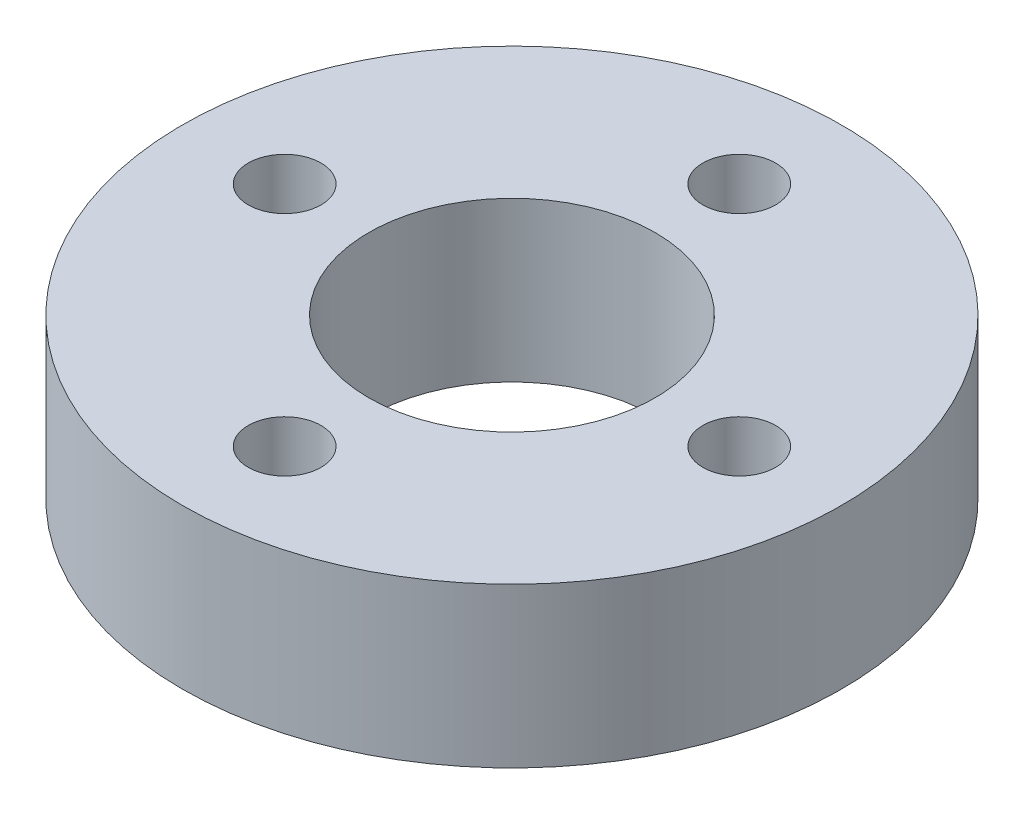
ISO-10303-21;
HEADER;
FILE_DESCRIPTION(('STEP AP214'),'2;1');
FILE_NAME('part.step','',(''),(''),'','','');
FILE_SCHEMA(('AUTOMOTIVE_DESIGN { 1 0 10303 214 1 1 1 1 }'));
ENDSEC;
DATA;
#1=APPLICATION_CONTEXT('core data for automotive mechanical design processes');
#2=APPLICATION_PROTOCOL_DEFINITION('international standard','automotive_design',2000,#1);
#3=PRODUCT_CONTEXT('',#1,'mechanical');
#4=PRODUCT('Part','Part','',(#3));
#5=PRODUCT_RELATED_PRODUCT_CATEGORY('part','',(#4));
#6=PRODUCT_DEFINITION_FORMATION('','',#4);
#7=PRODUCT_DEFINITION_CONTEXT('part definition',#1,'design');
#8=PRODUCT_DEFINITION('design','',#6,#7);
#9=PRODUCT_DEFINITION_SHAPE('','',#8);
#10=(LENGTH_UNIT() NAMED_UNIT(*) SI_UNIT(.MILLI.,.METRE.));
#11=(NAMED_UNIT(*) PLANE_ANGLE_UNIT() SI_UNIT($,.RADIAN.));
#12=(NAMED_UNIT(*) SI_UNIT($,.STERADIAN.) SOLID_ANGLE_UNIT());
#13=UNCERTAINTY_MEASURE_WITH_UNIT(LENGTH_MEASURE(1.E-05),#10,'distance_accuracy_value','');
#14=(GEOMETRIC_REPRESENTATION_CONTEXT(3) GLOBAL_UNCERTAINTY_ASSIGNED_CONTEXT((#13)) GLOBAL_UNIT_ASSIGNED_CONTEXT((#10,
#11,#12)) REPRESENTATION_CONTEXT('',''));
#15=CARTESIAN_POINT('',(0.,0.,0.));
#16=DIRECTION('',(0.,0.,1.));
#17=DIRECTION('',(1.,0.,0.));
#18=AXIS2_PLACEMENT_3D('',#15,#16,#17);
#19=CARTESIAN_POINT('',(0.,7.,0.));
#20=DIRECTION('',(0.,1.,0.));
#21=DIRECTION('',(0.,0.,1.));
#22=AXIS2_PLACEMENT_3D('',#19,#20,#21);
#23=PLANE('',#22);
#24=CARTESIAN_POINT('',(10.,7.,0.));
#25=DIRECTION('',(0.,1.,0.));
#26=DIRECTION('',(0.,0.,1.));
#27=AXIS2_PLACEMENT_3D('',#24,#25,#26);
#28=CIRCLE('',#27,1.6);
#29=CARTESIAN_POINT('',(10.,7.,1.6));
#30=VERTEX_POINT('',#29);
#31=EDGE_CURVE('E72',#30,#30,#28,.T.);
#32=ORIENTED_EDGE('',*,*,#31,.F.);
#33=EDGE_LOOP('',(#32));
#34=FACE_BOUND('',#33,.T.);
#35=CARTESIAN_POINT('',(-10.,7.,0.));
#36=DIRECTION('',(0.,1.,0.));
#37=DIRECTION('',(0.,0.,1.));
#38=AXIS2_PLACEMENT_3D('',#35,#36,#37);
#39=CIRCLE('',#38,1.6);
#40=CARTESIAN_POINT('',(-10.,7.,1.6));
#41=VERTEX_POINT('',#40);
#42=EDGE_CURVE('E56',#41,#41,#39,.T.);
#43=ORIENTED_EDGE('',*,*,#42,.F.);
#44=EDGE_LOOP('',(#43));
#45=FACE_BOUND('',#44,.T.);
#46=CARTESIAN_POINT('',(0.,7.,0.));
#47=DIRECTION('',(0.,1.,0.));
#48=DIRECTION('',(0.,0.,1.));
#49=AXIS2_PLACEMENT_3D('',#46,#47,#48);
#50=CIRCLE('',#49,14.5);
#51=CARTESIAN_POINT('',(0.,7.,14.5));
#52=VERTEX_POINT('',#51);
#53=EDGE_CURVE('E10',#52,#52,#50,.T.);
#54=ORIENTED_EDGE('',*,*,#53,.T.);
#55=EDGE_LOOP('',(#54));
#56=FACE_BOUND('',#55,.T.);
#57=CARTESIAN_POINT('',(0.,7.,0.));
#58=DIRECTION('',(0.,1.,0.));
#59=DIRECTION('',(0.,0.,1.));
#60=AXIS2_PLACEMENT_3D('',#57,#58,#59);
#61=CIRCLE('',#60,6.3);
#62=CARTESIAN_POINT('',(0.,7.,6.3));
#63=VERTEX_POINT('',#62);
#64=EDGE_CURVE('E50',#63,#63,#61,.T.);
#65=ORIENTED_EDGE('',*,*,#64,.F.);
#66=EDGE_LOOP('',(#65));
#67=FACE_BOUND('',#66,.T.);
#68=CARTESIAN_POINT('',(0.,7.,-10.));
#69=DIRECTION('',(0.,1.,0.));
#70=DIRECTION('',(0.,0.,1.));
#71=AXIS2_PLACEMENT_3D('',#68,#69,#70);
#72=CIRCLE('',#71,1.6);
#73=CARTESIAN_POINT('',(0.,7.,-8.4));
#74=VERTEX_POINT('',#73);
#75=EDGE_CURVE('E64',#74,#74,#72,.T.);
#76=ORIENTED_EDGE('',*,*,#75,.F.);
#77=EDGE_LOOP('',(#76));
#78=FACE_BOUND('',#77,.T.);
#79=CARTESIAN_POINT('',(0.,7.,10.));
#80=DIRECTION('',(0.,1.,0.));
#81=DIRECTION('',(0.,0.,1.));
#82=AXIS2_PLACEMENT_3D('',#79,#80,#81);
#83=CIRCLE('',#82,1.6);
#84=CARTESIAN_POINT('',(0.,7.,11.6));
#85=VERTEX_POINT('',#84);
#86=EDGE_CURVE('E80',#85,#85,#83,.T.);
#87=ORIENTED_EDGE('',*,*,#86,.F.);
#88=EDGE_LOOP('',(#87));
#89=FACE_BOUND('',#88,.T.);
#90=ADVANCED_FACE('F37',(#34,#45,#56,#67,#78,#89),#23,.T.);
#91=CARTESIAN_POINT('',(0.,0.,0.));
#92=DIRECTION('',(0.,1.,0.));
#93=DIRECTION('',(0.,0.,1.));
#94=AXIS2_PLACEMENT_3D('',#91,#92,#93);
#95=PLANE('',#94);
#96=CARTESIAN_POINT('',(0.,0.,0.));
#97=DIRECTION('',(0.,1.,0.));
#98=DIRECTION('',(0.,0.,1.));
#99=AXIS2_PLACEMENT_3D('',#96,#97,#98);
#100=CIRCLE('',#99,14.5);
#101=CARTESIAN_POINT('',(0.,0.,14.5));
#102=VERTEX_POINT('',#101);
#103=EDGE_CURVE('E41',#102,#102,#100,.T.);
#104=ORIENTED_EDGE('',*,*,#103,.F.);
#105=EDGE_LOOP('',(#104));
#106=FACE_BOUND('',#105,.T.);
#107=CARTESIAN_POINT('',(0.,0.,0.));
#108=DIRECTION('',(0.,1.,0.));
#109=DIRECTION('',(0.,0.,1.));
#110=AXIS2_PLACEMENT_3D('',#107,#108,#109);
#111=CIRCLE('',#110,6.3);
#112=CARTESIAN_POINT('',(0.,0.,6.3));
#113=VERTEX_POINT('',#112);
#114=EDGE_CURVE('E52',#113,#113,#111,.T.);
#115=ORIENTED_EDGE('',*,*,#114,.T.);
#116=EDGE_LOOP('',(#115));
#117=FACE_BOUND('',#116,.T.);
#118=CARTESIAN_POINT('',(-10.,0.,0.));
#119=DIRECTION('',(0.,1.,0.));
#120=DIRECTION('',(0.,0.,1.));
#121=AXIS2_PLACEMENT_3D('',#118,#119,#120);
#122=CIRCLE('',#121,1.6);
#123=CARTESIAN_POINT('',(-10.,0.,1.6));
#124=VERTEX_POINT('',#123);
#125=EDGE_CURVE('E60',#124,#124,#122,.T.);
#126=ORIENTED_EDGE('',*,*,#125,.T.);
#127=EDGE_LOOP('',(#126));
#128=FACE_BOUND('',#127,.T.);
#129=CARTESIAN_POINT('',(0.,0.,-10.));
#130=DIRECTION('',(0.,1.,0.));
#131=DIRECTION('',(0.,0.,1.));
#132=AXIS2_PLACEMENT_3D('',#129,#130,#131);
#133=CIRCLE('',#132,1.6);
#134=CARTESIAN_POINT('',(0.,0.,-8.4));
#135=VERTEX_POINT('',#134);
#136=EDGE_CURVE('E68',#135,#135,#133,.T.);
#137=ORIENTED_EDGE('',*,*,#136,.T.);
#138=EDGE_LOOP('',(#137));
#139=FACE_BOUND('',#138,.T.);
#140=CARTESIAN_POINT('',(10.,0.,0.));
#141=DIRECTION('',(0.,1.,0.));
#142=DIRECTION('',(0.,0.,1.));
#143=AXIS2_PLACEMENT_3D('',#140,#141,#142);
#144=CIRCLE('',#143,1.6);
#145=CARTESIAN_POINT('',(10.,0.,1.6));
#146=VERTEX_POINT('',#145);
#147=EDGE_CURVE('E76',#146,#146,#144,.T.);
#148=ORIENTED_EDGE('',*,*,#147,.T.);
#149=EDGE_LOOP('',(#148));
#150=FACE_BOUND('',#149,.T.);
#151=CARTESIAN_POINT('',(0.,0.,10.));
#152=DIRECTION('',(0.,1.,0.));
#153=DIRECTION('',(0.,0.,1.));
#154=AXIS2_PLACEMENT_3D('',#151,#152,#153);
#155=CIRCLE('',#154,1.6);
#156=CARTESIAN_POINT('',(0.,0.,11.6));
#157=VERTEX_POINT('',#156);
#158=EDGE_CURVE('E84',#157,#157,#155,.T.);
#159=ORIENTED_EDGE('',*,*,#158,.T.);
#160=EDGE_LOOP('',(#159));
#161=FACE_BOUND('',#160,.T.);
#162=ADVANCED_FACE('F96',(#106,#117,#128,#139,#150,#161),#95,.F.);
#163=CARTESIAN_POINT('',(0.,7.,0.));
#164=DIRECTION('',(0.,-1.,0.));
#165=DIRECTION('',(0.,0.,-1.));
#166=AXIS2_PLACEMENT_3D('',#163,#164,#165);
#167=CYLINDRICAL_SURFACE('',#166,14.5);
#168=ORIENTED_EDGE('',*,*,#53,.F.);
#169=EDGE_LOOP('',(#168));
#170=FACE_BOUND('',#169,.T.);
#171=ORIENTED_EDGE('',*,*,#103,.T.);
#172=EDGE_LOOP('',(#171));
#173=FACE_BOUND('',#172,.T.);
#174=ADVANCED_FACE('F39',(#170,#173),#167,.T.);
#175=CARTESIAN_POINT('',(0.,7.,0.));
#176=DIRECTION('',(0.,-1.,0.));
#177=DIRECTION('',(0.,0.,-1.));
#178=AXIS2_PLACEMENT_3D('',#175,#176,#177);
#179=CYLINDRICAL_SURFACE('',#178,6.3);
#180=ORIENTED_EDGE('',*,*,#64,.T.);
#181=EDGE_LOOP('',(#180));
#182=FACE_BOUND('',#181,.T.);
#183=ORIENTED_EDGE('',*,*,#114,.F.);
#184=EDGE_LOOP('',(#183));
#185=FACE_BOUND('',#184,.T.);
#186=ADVANCED_FACE('F106',(#182,#185),#179,.F.);
#187=CARTESIAN_POINT('',(-10.,7.,0.));
#188=DIRECTION('',(0.,-1.,0.));
#189=DIRECTION('',(0.,0.,-1.));
#190=AXIS2_PLACEMENT_3D('',#187,#188,#189);
#191=CYLINDRICAL_SURFACE('',#190,1.6);
#192=ORIENTED_EDGE('',*,*,#42,.T.);
#193=EDGE_LOOP('',(#192));
#194=FACE_BOUND('',#193,.T.);
#195=ORIENTED_EDGE('',*,*,#125,.F.);
#196=EDGE_LOOP('',(#195));
#197=FACE_BOUND('',#196,.T.);
#198=ADVANCED_FACE('F109',(#194,#197),#191,.F.);
#199=CARTESIAN_POINT('',(0.,7.,-10.));
#200=DIRECTION('',(0.,-1.,0.));
#201=DIRECTION('',(0.,0.,-1.));
#202=AXIS2_PLACEMENT_3D('',#199,#200,#201);
#203=CYLINDRICAL_SURFACE('',#202,1.6);
#204=ORIENTED_EDGE('',*,*,#75,.T.);
#205=EDGE_LOOP('',(#204));
#206=FACE_BOUND('',#205,.T.);
#207=ORIENTED_EDGE('',*,*,#136,.F.);
#208=EDGE_LOOP('',(#207));
#209=FACE_BOUND('',#208,.T.);
#210=ADVANCED_FACE('F113',(#206,#209),#203,.F.);
#211=CARTESIAN_POINT('',(10.,7.,0.));
#212=DIRECTION('',(0.,-1.,0.));
#213=DIRECTION('',(0.,0.,-1.));
#214=AXIS2_PLACEMENT_3D('',#211,#212,#213);
#215=CYLINDRICAL_SURFACE('',#214,1.6);
#216=ORIENTED_EDGE('',*,*,#31,.T.);
#217=EDGE_LOOP('',(#216));
#218=FACE_BOUND('',#217,.T.);
#219=ORIENTED_EDGE('',*,*,#147,.F.);
#220=EDGE_LOOP('',(#219));
#221=FACE_BOUND('',#220,.T.);
#222=ADVANCED_FACE('F117',(#218,#221),#215,.F.);
#223=CARTESIAN_POINT('',(0.,7.,10.));
#224=DIRECTION('',(0.,-1.,0.));
#225=DIRECTION('',(0.,0.,-1.));
#226=AXIS2_PLACEMENT_3D('',#223,#224,#225);
#227=CYLINDRICAL_SURFACE('',#226,1.6);
#228=ORIENTED_EDGE('',*,*,#86,.T.);
#229=EDGE_LOOP('',(#228));
#230=FACE_BOUND('',#229,.T.);
#231=ORIENTED_EDGE('',*,*,#158,.F.);
#232=EDGE_LOOP('',(#231));
#233=FACE_BOUND('',#232,.T.);
#234=ADVANCED_FACE('F92',(#230,#233),#227,.F.);
#235=CLOSED_SHELL('',(#90,#162,#174,#186,#198,#210,#222,#234));
#236=MANIFOLD_SOLID_BREP('B2',#235);
#237=ADVANCED_BREP_SHAPE_REPRESENTATION('',(#18,#236),#14);
#238=SHAPE_DEFINITION_REPRESENTATION(#9,#237);
ENDSEC;
END-ISO-10303-21;
